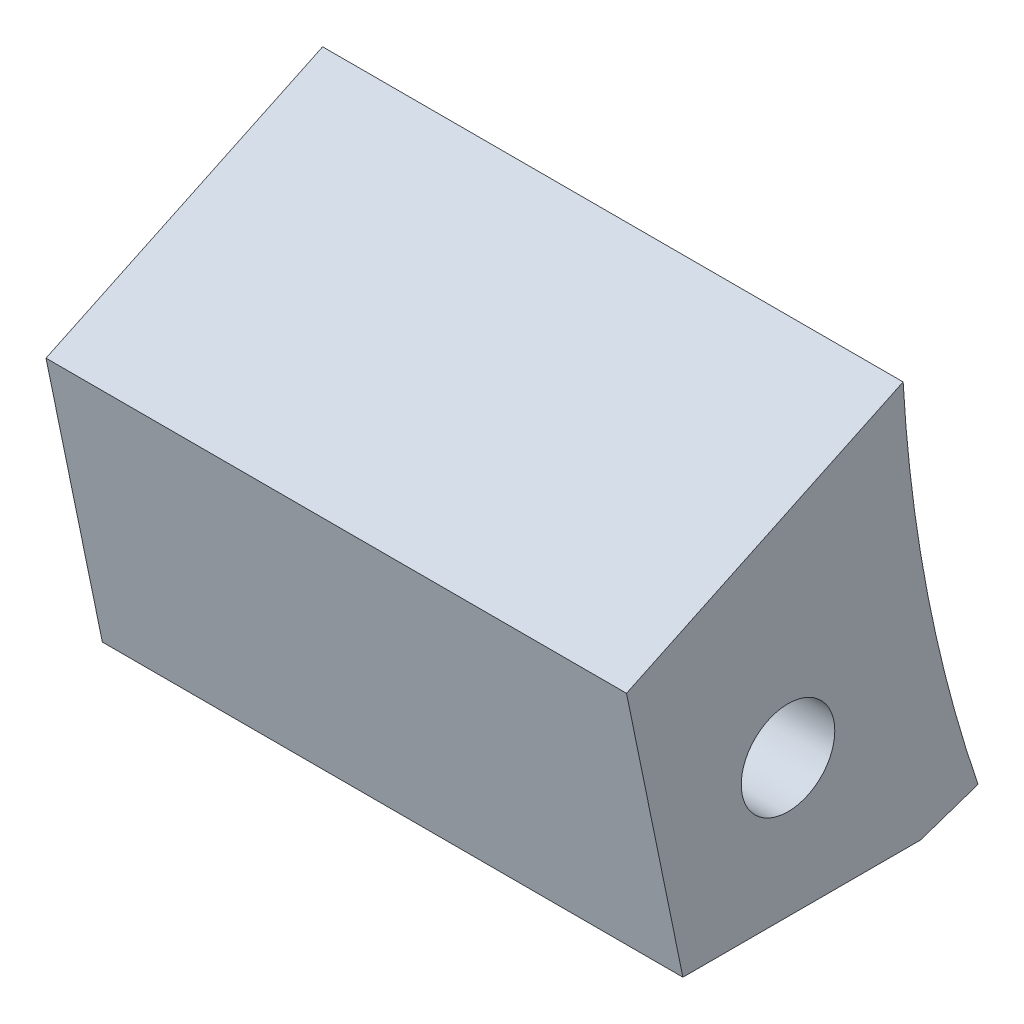
ISO-10303-21;
HEADER;
FILE_DESCRIPTION(('STEP AP214'),'2;1');
FILE_NAME('part.step','',(''),(''),'','','');
FILE_SCHEMA(('AUTOMOTIVE_DESIGN { 1 0 10303 214 1 1 1 1 }'));
ENDSEC;
DATA;
#1=APPLICATION_CONTEXT('core data for automotive mechanical design processes');
#2=APPLICATION_PROTOCOL_DEFINITION('international standard','automotive_design',2000,#1);
#3=PRODUCT_CONTEXT('',#1,'mechanical');
#4=PRODUCT('Part','Part','',(#3));
#5=PRODUCT_RELATED_PRODUCT_CATEGORY('part','',(#4));
#6=PRODUCT_DEFINITION_FORMATION('','',#4);
#7=PRODUCT_DEFINITION_CONTEXT('part definition',#1,'design');
#8=PRODUCT_DEFINITION('design','',#6,#7);
#9=PRODUCT_DEFINITION_SHAPE('','',#8);
#10=(LENGTH_UNIT() NAMED_UNIT(*) SI_UNIT(.MILLI.,.METRE.));
#11=(NAMED_UNIT(*) PLANE_ANGLE_UNIT() SI_UNIT($,.RADIAN.));
#12=(NAMED_UNIT(*) SI_UNIT($,.STERADIAN.) SOLID_ANGLE_UNIT());
#13=UNCERTAINTY_MEASURE_WITH_UNIT(LENGTH_MEASURE(1.E-05),#10,'distance_accuracy_value','');
#14=(GEOMETRIC_REPRESENTATION_CONTEXT(3) GLOBAL_UNCERTAINTY_ASSIGNED_CONTEXT((#13)) GLOBAL_UNIT_ASSIGNED_CONTEXT((#10,
#11,#12)) REPRESENTATION_CONTEXT('',''));
#15=CARTESIAN_POINT('',(0.,0.,0.));
#16=DIRECTION('',(0.,0.,1.));
#17=DIRECTION('',(1.,0.,0.));
#18=AXIS2_PLACEMENT_3D('',#15,#16,#17);
#19=CARTESIAN_POINT('',(30.0524797119658,52.,0.));
#20=DIRECTION('',(-1.,0.,0.));
#21=DIRECTION('',(0.,0.,1.));
#22=AXIS2_PLACEMENT_3D('',#19,#20,#21);
#23=CYLINDRICAL_SURFACE('',#22,53.);
#24=CARTESIAN_POINT('',(10.55,52.,0.));
#25=DIRECTION('',(1.,0.,0.));
#26=DIRECTION('',(0.,0.,-1.));
#27=AXIS2_PLACEMENT_3D('',#24,#25,#26);
#28=CIRCLE('',#27,53.);
#29=CARTESIAN_POINT('',(10.55,34.9861810873278,50.1949197230835));
#30=VERTEX_POINT('',#29);
#31=CARTESIAN_POINT('',(10.55,49.0149333615906,52.9158707493721));
#32=VERTEX_POINT('',#31);
#33=EDGE_CURVE('E106',#30,#32,#28,.F.);
#34=ORIENTED_EDGE('',*,*,#33,.F.);
#35=DIRECTION('',(-1.,0.,0.));
#36=VECTOR('',#35,1.);
#37=CARTESIAN_POINT('',(30.0524797119658,34.9861810873278,50.1949197230835));
#38=LINE('',#37,#36);
#39=CARTESIAN_POINT('',(-10.55,34.9861810873278,50.1949197230835));
#40=VERTEX_POINT('',#39);
#41=EDGE_CURVE('E60',#30,#40,#38,.T.);
#42=ORIENTED_EDGE('',*,*,#41,.T.);
#43=CARTESIAN_POINT('',(-10.55,52.,0.));
#44=DIRECTION('',(-1.,0.,0.));
#45=DIRECTION('',(0.,0.,1.));
#46=AXIS2_PLACEMENT_3D('',#43,#44,#45);
#47=CIRCLE('',#46,53.);
#48=CARTESIAN_POINT('',(-10.55,49.0149333615906,52.9158707493721));
#49=VERTEX_POINT('',#48);
#50=EDGE_CURVE('E114',#40,#49,#47,.T.);
#51=ORIENTED_EDGE('',*,*,#50,.T.);
#52=DIRECTION('',(-1.,0.,0.));
#53=VECTOR('',#52,1.);
#54=CARTESIAN_POINT('',(30.0524797119658,49.0149333615906,52.9158707493721));
#55=LINE('',#54,#53);
#56=EDGE_CURVE('E102',#32,#49,#55,.T.);
#57=ORIENTED_EDGE('',*,*,#56,.F.);
#58=EDGE_LOOP('',(#34,#42,#51,#57));
#59=FACE_BOUND('',#58,.T.);
#60=ADVANCED_FACE('F43',(#59),#23,.F.);
#61=CARTESIAN_POINT('',(30.0524797119658,44.2410888388321,62.9700715061244));
#62=DIRECTION('',(0.,-0.903343682674119,-0.428917464056618));
#63=DIRECTION('',(0.,0.428917464056618,-0.903343682674119));
#64=AXIS2_PLACEMENT_3D('',#61,#62,#63);
#65=PLANE('',#64);
#66=DIRECTION('',(0.,-0.428917464056618,0.903343682674119));
#67=VECTOR('',#66,1.);
#68=CARTESIAN_POINT('',(10.55,44.2410888388321,62.9700715061244));
#69=LINE('',#68,#67);
#70=CARTESIAN_POINT('',(10.55,44.2410888388321,62.9700715061244));
#71=VERTEX_POINT('',#70);
#72=EDGE_CURVE('E93',#32,#71,#69,.T.);
#73=ORIENTED_EDGE('',*,*,#72,.F.);
#74=ORIENTED_EDGE('',*,*,#56,.T.);
#75=DIRECTION('',(0.,-0.428917464056618,0.903343682674119));
#76=VECTOR('',#75,1.);
#77=CARTESIAN_POINT('',(-10.55,44.2410888388321,62.9700715061244));
#78=LINE('',#77,#76);
#79=CARTESIAN_POINT('',(-10.55,44.2410888388321,62.9700715061244));
#80=VERTEX_POINT('',#79);
#81=EDGE_CURVE('E101',#49,#80,#78,.T.);
#82=ORIENTED_EDGE('',*,*,#81,.T.);
#83=DIRECTION('',(-1.,0.,0.));
#84=VECTOR('',#83,1.);
#85=CARTESIAN_POINT('',(30.0524797119658,44.2410888388321,62.9700715061244));
#86=LINE('',#85,#84);
#87=EDGE_CURVE('E87',#71,#80,#86,.T.);
#88=ORIENTED_EDGE('',*,*,#87,.F.);
#89=EDGE_LOOP('',(#73,#74,#82,#88));
#90=FACE_BOUND('',#89,.T.);
#91=ADVANCED_FACE('F97',(#90),#65,.F.);
#92=CARTESIAN_POINT('',(30.0524797119658,34.2791873052857,60.9212886053157));
#93=DIRECTION('',(0.,0.201445697603812,-0.979499683979997));
#94=DIRECTION('',(0.,0.979499683979997,0.201445697603812));
#95=AXIS2_PLACEMENT_3D('',#92,#93,#94);
#96=PLANE('',#95);
#97=DIRECTION('',(0.,-0.979499683979997,-0.201445697603812));
#98=VECTOR('',#97,1.);
#99=CARTESIAN_POINT('',(10.55,34.2791873052857,60.9212886053157));
#100=LINE('',#99,#98);
#101=CARTESIAN_POINT('',(10.55,34.2791873052857,60.9212886053157));
#102=VERTEX_POINT('',#101);
#103=EDGE_CURVE('E52',#71,#102,#100,.T.);
#104=ORIENTED_EDGE('',*,*,#103,.F.);
#105=ORIENTED_EDGE('',*,*,#87,.T.);
#106=DIRECTION('',(0.,-0.979499683979997,-0.201445697603812));
#107=VECTOR('',#106,1.);
#108=CARTESIAN_POINT('',(-10.55,34.2791873052857,60.9212886053157));
#109=LINE('',#108,#107);
#110=CARTESIAN_POINT('',(-10.55,34.2791873052857,60.9212886053157));
#111=VERTEX_POINT('',#110);
#112=EDGE_CURVE('E127',#80,#111,#109,.T.);
#113=ORIENTED_EDGE('',*,*,#112,.T.);
#114=DIRECTION('',(-1.,0.,0.));
#115=VECTOR('',#114,1.);
#116=CARTESIAN_POINT('',(30.0524797119658,34.2791873052857,60.9212886053157));
#117=LINE('',#116,#115);
#118=EDGE_CURVE('E90',#102,#111,#117,.T.);
#119=ORIENTED_EDGE('',*,*,#118,.F.);
#120=EDGE_LOOP('',(#104,#105,#113,#119));
#121=FACE_BOUND('',#120,.T.);
#122=ADVANCED_FACE('F84',(#121),#96,.F.);
#123=CARTESIAN_POINT('',(30.0524797119658,34.2791873052857,60.9212886053157));
#124=DIRECTION('',(0.,1.,0.));
#125=DIRECTION('',(0.,0.,1.));
#126=AXIS2_PLACEMENT_3D('',#123,#124,#125);
#127=PLANE('',#126);
#128=DIRECTION('',(0.,0.,-1.));
#129=VECTOR('',#128,1.);
#130=CARTESIAN_POINT('',(10.55,34.2791873052857,60.9212886053157));
#131=LINE('',#130,#129);
#132=CARTESIAN_POINT('',(10.55,34.2791873052857,52.2807239929225));
#133=VERTEX_POINT('',#132);
#134=EDGE_CURVE('E11',#102,#133,#131,.T.);
#135=ORIENTED_EDGE('',*,*,#134,.F.);
#136=ORIENTED_EDGE('',*,*,#118,.T.);
#137=DIRECTION('',(0.,0.,-1.));
#138=VECTOR('',#137,1.);
#139=CARTESIAN_POINT('',(-10.55,34.2791873052857,60.9212886053157));
#140=LINE('',#139,#138);
#141=CARTESIAN_POINT('',(-10.55,34.2791873052857,52.2807239929225));
#142=VERTEX_POINT('',#141);
#143=EDGE_CURVE('E121',#111,#142,#140,.T.);
#144=ORIENTED_EDGE('',*,*,#143,.T.);
#145=DIRECTION('',(-1.,0.,0.));
#146=VECTOR('',#145,1.);
#147=CARTESIAN_POINT('',(30.0524797119658,34.2791873052857,52.2807239929225));
#148=LINE('',#147,#146);
#149=EDGE_CURVE('E69',#133,#142,#148,.T.);
#150=ORIENTED_EDGE('',*,*,#149,.F.);
#151=EDGE_LOOP('',(#135,#136,#144,#150));
#152=FACE_BOUND('',#151,.T.);
#153=ADVANCED_FACE('F148',(#152),#127,.F.);
#154=CARTESIAN_POINT('',(30.0524797119658,34.2791873052857,52.2807239929225));
#155=DIRECTION('',(0.,0.947073957039311,0.321015451182495));
#156=DIRECTION('',(0.,-0.321015451182495,0.947073957039311));
#157=AXIS2_PLACEMENT_3D('',#154,#155,#156);
#158=PLANE('',#157);
#159=DIRECTION('',(0.,0.321015451182495,-0.947073957039311));
#160=VECTOR('',#159,1.);
#161=CARTESIAN_POINT('',(10.55,34.2791873052857,52.2807239929225));
#162=LINE('',#161,#160);
#163=EDGE_CURVE('E108',#133,#30,#162,.T.);
#164=ORIENTED_EDGE('',*,*,#163,.F.);
#165=ORIENTED_EDGE('',*,*,#149,.T.);
#166=DIRECTION('',(0.,0.321015451182495,-0.947073957039311));
#167=VECTOR('',#166,1.);
#168=CARTESIAN_POINT('',(-10.55,34.2791873052857,52.2807239929225));
#169=LINE('',#168,#167);
#170=EDGE_CURVE('E119',#142,#40,#169,.T.);
#171=ORIENTED_EDGE('',*,*,#170,.T.);
#172=ORIENTED_EDGE('',*,*,#41,.F.);
#173=EDGE_LOOP('',(#164,#165,#171,#172));
#174=FACE_BOUND('',#173,.T.);
#175=ADVANCED_FACE('F140',(#174),#158,.F.);
#176=CARTESIAN_POINT('',(10.55,52.,0.));
#177=DIRECTION('',(1.,0.,0.));
#178=DIRECTION('',(0.,0.,-1.));
#179=AXIS2_PLACEMENT_3D('',#176,#177,#178);
#180=PLANE('',#179);
#181=CARTESIAN_POINT('',(10.55,39.2791873052857,57.1001832255028));
#182=DIRECTION('',(1.,0.,0.));
#183=DIRECTION('',(0.,0.,-1.));
#184=AXIS2_PLACEMENT_3D('',#181,#182,#183);
#185=CIRCLE('',#184,1.69999999999999);
#186=CARTESIAN_POINT('',(10.55,39.2791873052857,55.4001832255029));
#187=VERTEX_POINT('',#186);
#188=EDGE_CURVE('E47',#187,#187,#185,.T.);
#189=ORIENTED_EDGE('',*,*,#188,.F.);
#190=EDGE_LOOP('',(#189));
#191=FACE_BOUND('',#190,.T.);
#192=ORIENTED_EDGE('',*,*,#163,.T.);
#193=ORIENTED_EDGE('',*,*,#33,.T.);
#194=ORIENTED_EDGE('',*,*,#72,.T.);
#195=ORIENTED_EDGE('',*,*,#103,.T.);
#196=ORIENTED_EDGE('',*,*,#134,.T.);
#197=EDGE_LOOP('',(#192,#193,#194,#195,#196));
#198=FACE_BOUND('',#197,.T.);
#199=ADVANCED_FACE('F45',(#191,#198),#180,.T.);
#200=CARTESIAN_POINT('',(-10.55,52.,0.));
#201=DIRECTION('',(-1.,0.,0.));
#202=DIRECTION('',(0.,0.,-1.));
#203=AXIS2_PLACEMENT_3D('',#200,#201,#202);
#204=PLANE('',#203);
#205=CARTESIAN_POINT('',(-10.55,39.2791873052857,57.1001832255028));
#206=DIRECTION('',(-1.,0.,0.));
#207=DIRECTION('',(0.,0.,1.));
#208=AXIS2_PLACEMENT_3D('',#205,#206,#207);
#209=CIRCLE('',#208,1.69999999999999);
#210=CARTESIAN_POINT('',(-10.55,39.2791873052857,58.8001832255028));
#211=VERTEX_POINT('',#210);
#212=EDGE_CURVE('E129',#211,#211,#209,.T.);
#213=ORIENTED_EDGE('',*,*,#212,.F.);
#214=EDGE_LOOP('',(#213));
#215=FACE_BOUND('',#214,.T.);
#216=ORIENTED_EDGE('',*,*,#50,.F.);
#217=ORIENTED_EDGE('',*,*,#170,.F.);
#218=ORIENTED_EDGE('',*,*,#143,.F.);
#219=ORIENTED_EDGE('',*,*,#112,.F.);
#220=ORIENTED_EDGE('',*,*,#81,.F.);
#221=EDGE_LOOP('',(#216,#217,#218,#219,#220));
#222=FACE_BOUND('',#221,.T.);
#223=ADVANCED_FACE('F139',(#215,#222),#204,.T.);
#224=CARTESIAN_POINT('',(20.55,39.2791873052857,57.1001832255028));
#225=DIRECTION('',(1.,0.,0.));
#226=DIRECTION('',(0.,0.,-1.));
#227=AXIS2_PLACEMENT_3D('',#224,#225,#226);
#228=CYLINDRICAL_SURFACE('',#227,1.69999999999999);
#229=ORIENTED_EDGE('',*,*,#212,.T.);
#230=EDGE_LOOP('',(#229));
#231=FACE_BOUND('',#230,.T.);
#232=ORIENTED_EDGE('',*,*,#188,.T.);
#233=EDGE_LOOP('',(#232));
#234=FACE_BOUND('',#233,.T.);
#235=ADVANCED_FACE('F136',(#231,#234),#228,.F.);
#236=CLOSED_SHELL('',(#60,#91,#122,#153,#175,#199,#223,#235));
#237=MANIFOLD_SOLID_BREP('B2',#236);
#238=ADVANCED_BREP_SHAPE_REPRESENTATION('',(#18,#237),#14);
#239=SHAPE_DEFINITION_REPRESENTATION(#9,#238);
ENDSEC;
END-ISO-10303-21;
